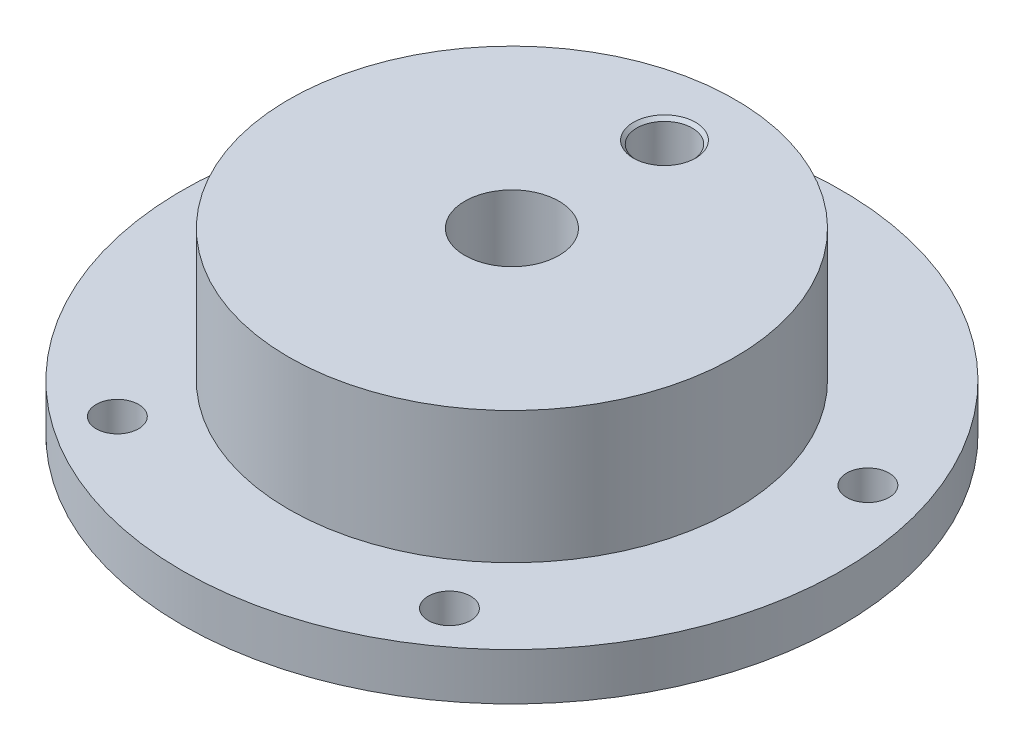
ISO-10303-21;
HEADER;
FILE_DESCRIPTION(('STEP AP214'),'2;1');
FILE_NAME('part.step','',(''),(''),'','','');
FILE_SCHEMA(('AUTOMOTIVE_DESIGN { 1 0 10303 214 1 1 1 1 }'));
ENDSEC;
DATA;
#1=APPLICATION_CONTEXT('core data for automotive mechanical design processes');
#2=APPLICATION_PROTOCOL_DEFINITION('international standard','automotive_design',2000,#1);
#3=PRODUCT_CONTEXT('',#1,'mechanical');
#4=PRODUCT('Part','Part','',(#3));
#5=PRODUCT_RELATED_PRODUCT_CATEGORY('part','',(#4));
#6=PRODUCT_DEFINITION_FORMATION('','',#4);
#7=PRODUCT_DEFINITION_CONTEXT('part definition',#1,'design');
#8=PRODUCT_DEFINITION('design','',#6,#7);
#9=PRODUCT_DEFINITION_SHAPE('','',#8);
#10=(LENGTH_UNIT() NAMED_UNIT(*) SI_UNIT(.MILLI.,.METRE.));
#11=(NAMED_UNIT(*) PLANE_ANGLE_UNIT() SI_UNIT($,.RADIAN.));
#12=(NAMED_UNIT(*) SI_UNIT($,.STERADIAN.) SOLID_ANGLE_UNIT());
#13=UNCERTAINTY_MEASURE_WITH_UNIT(LENGTH_MEASURE(1.E-05),#10,'distance_accuracy_value','');
#14=(GEOMETRIC_REPRESENTATION_CONTEXT(3) GLOBAL_UNCERTAINTY_ASSIGNED_CONTEXT((#13)) GLOBAL_UNIT_ASSIGNED_CONTEXT((#10,
#11,#12)) REPRESENTATION_CONTEXT('',''));
#15=CARTESIAN_POINT('',(0.,0.,0.));
#16=DIRECTION('',(0.,0.,1.));
#17=DIRECTION('',(1.,0.,0.));
#18=AXIS2_PLACEMENT_3D('',#15,#16,#17);
#19=CARTESIAN_POINT('',(-47.4,0.,0.));
#20=DIRECTION('',(0.,1.,0.));
#21=DIRECTION('',(0.,0.,1.));
#22=AXIS2_PLACEMENT_3D('',#19,#20,#21);
#23=PLANE('',#22);
#24=CARTESIAN_POINT('',(0.,0.,-32.4));
#25=DIRECTION('',(0.,1.,0.));
#26=DIRECTION('',(0.,0.,1.));
#27=AXIS2_PLACEMENT_3D('',#24,#25,#26);
#28=CIRCLE('',#27,6.6035);
#29=CARTESIAN_POINT('',(0.,0.,-25.7965));
#30=VERTEX_POINT('',#29);
#31=EDGE_CURVE('E196',#30,#30,#28,.T.);
#32=ORIENTED_EDGE('',*,*,#31,.F.);
#33=EDGE_LOOP('',(#32));
#34=FACE_BOUND('',#33,.T.);
#35=CARTESIAN_POINT('',(0.,0.,0.));
#36=DIRECTION('',(0.,1.,0.));
#37=DIRECTION('',(0.,0.,1.));
#38=AXIS2_PLACEMENT_3D('',#35,#36,#37);
#39=CIRCLE('',#38,47.4);
#40=CARTESIAN_POINT('',(0.,0.,47.4));
#41=VERTEX_POINT('',#40);
#42=EDGE_CURVE('E10',#41,#41,#39,.T.);
#43=ORIENTED_EDGE('',*,*,#42,.T.);
#44=EDGE_LOOP('',(#43));
#45=FACE_BOUND('',#44,.T.);
#46=CARTESIAN_POINT('',(0.,0.,0.));
#47=DIRECTION('',(0.,1.,0.));
#48=DIRECTION('',(0.,0.,1.));
#49=AXIS2_PLACEMENT_3D('',#46,#47,#48);
#50=CIRCLE('',#49,10.);
#51=CARTESIAN_POINT('',(0.,0.,10.));
#52=VERTEX_POINT('',#51);
#53=EDGE_CURVE('E184',#52,#52,#50,.T.);
#54=ORIENTED_EDGE('',*,*,#53,.F.);
#55=EDGE_LOOP('',(#54));
#56=FACE_BOUND('',#55,.T.);
#57=ADVANCED_FACE('F45',(#34,#45,#56),#23,.T.);
#58=CARTESIAN_POINT('',(0.,0.,0.));
#59=DIRECTION('',(0.,1.,0.));
#60=DIRECTION('',(0.,0.,1.));
#61=AXIS2_PLACEMENT_3D('',#58,#59,#60);
#62=CYLINDRICAL_SURFACE('',#61,47.4);
#63=CARTESIAN_POINT('',(0.,-28.,0.));
#64=DIRECTION('',(0.,1.,0.));
#65=DIRECTION('',(0.,0.,1.));
#66=AXIS2_PLACEMENT_3D('',#63,#64,#65);
#67=CIRCLE('',#66,47.4);
#68=CARTESIAN_POINT('',(0.,-28.,47.4));
#69=VERTEX_POINT('',#68);
#70=EDGE_CURVE('E52',#69,#69,#67,.T.);
#71=ORIENTED_EDGE('',*,*,#70,.T.);
#72=EDGE_LOOP('',(#71));
#73=FACE_BOUND('',#72,.T.);
#74=ORIENTED_EDGE('',*,*,#42,.F.);
#75=EDGE_LOOP('',(#74));
#76=FACE_BOUND('',#75,.T.);
#77=ADVANCED_FACE('F255',(#73,#76),#62,.T.);
#78=CARTESIAN_POINT('',(-70.,-28.,0.));
#79=DIRECTION('',(0.,1.,0.));
#80=DIRECTION('',(0.,0.,1.));
#81=AXIS2_PLACEMENT_3D('',#78,#79,#80);
#82=PLANE('',#81);
#83=CARTESIAN_POINT('',(57.0633909777093,-28.,-18.5410196624967));
#84=DIRECTION('',(0.,1.,0.));
#85=DIRECTION('',(-0.951056516295155,0.,0.309016994374945));
#86=AXIS2_PLACEMENT_3D('',#83,#84,#85);
#87=CIRCLE('',#86,4.5);
#88=CARTESIAN_POINT('',(52.7836366543811,-28.,-17.1504431878094));
#89=VERTEX_POINT('',#88);
#90=EDGE_CURVE('E233',#89,#89,#87,.T.);
#91=ORIENTED_EDGE('',*,*,#90,.F.);
#92=EDGE_LOOP('',(#91));
#93=FACE_BOUND('',#92,.T.);
#94=CARTESIAN_POINT('',(35.2671151375481,-28.,48.541019662497));
#95=DIRECTION('',(0.,1.,0.));
#96=DIRECTION('',(-0.587785252292469,0.,-0.809016994374951));
#97=AXIS2_PLACEMENT_3D('',#94,#95,#96);
#98=CIRCLE('',#97,4.5);
#99=CARTESIAN_POINT('',(32.622081502232,-28.,44.9004431878098));
#100=VERTEX_POINT('',#99);
#101=EDGE_CURVE('E225',#100,#100,#98,.T.);
#102=ORIENTED_EDGE('',*,*,#101,.F.);
#103=EDGE_LOOP('',(#102));
#104=FACE_BOUND('',#103,.T.);
#105=CARTESIAN_POINT('',(-35.2671151375488,-28.,48.5410196624965));
#106=DIRECTION('',(0.,1.,0.));
#107=DIRECTION('',(0.58778525229248,0.,-0.809016994374942));
#108=AXIS2_PLACEMENT_3D('',#105,#106,#107);
#109=CIRCLE('',#108,4.5);
#110=CARTESIAN_POINT('',(-32.6220815022327,-28.,44.9004431878093));
#111=VERTEX_POINT('',#110);
#112=EDGE_CURVE('E217',#111,#111,#109,.T.);
#113=ORIENTED_EDGE('',*,*,#112,.F.);
#114=EDGE_LOOP('',(#113));
#115=FACE_BOUND('',#114,.T.);
#116=CARTESIAN_POINT('',(-57.063390977709,-28.,-18.5410196624975));
#117=DIRECTION('',(0.,1.,0.));
#118=DIRECTION('',(0.95105651629515,0.,0.309016994374958));
#119=AXIS2_PLACEMENT_3D('',#116,#117,#118);
#120=CIRCLE('',#119,4.5);
#121=CARTESIAN_POINT('',(-52.7836366543808,-28.,-17.1504431878102));
#122=VERTEX_POINT('',#121);
#123=EDGE_CURVE('E209',#122,#122,#120,.T.);
#124=ORIENTED_EDGE('',*,*,#123,.F.);
#125=EDGE_LOOP('',(#124));
#126=FACE_BOUND('',#125,.T.);
#127=CARTESIAN_POINT('',(0.,-28.,-60.));
#128=DIRECTION('',(0.,1.,0.));
#129=DIRECTION('',(0.,0.,1.));
#130=AXIS2_PLACEMENT_3D('',#127,#128,#129);
#131=CIRCLE('',#130,4.5);
#132=CARTESIAN_POINT('',(0.,-28.,-55.5));
#133=VERTEX_POINT('',#132);
#134=EDGE_CURVE('E201',#133,#133,#131,.T.);
#135=ORIENTED_EDGE('',*,*,#134,.F.);
#136=EDGE_LOOP('',(#135));
#137=FACE_BOUND('',#136,.T.);
#138=CARTESIAN_POINT('',(0.,-28.,0.));
#139=DIRECTION('',(0.,1.,0.));
#140=DIRECTION('',(0.,0.,1.));
#141=AXIS2_PLACEMENT_3D('',#138,#139,#140);
#142=CIRCLE('',#141,70.);
#143=CARTESIAN_POINT('',(0.,-28.,70.));
#144=VERTEX_POINT('',#143);
#145=EDGE_CURVE('E57',#144,#144,#142,.T.);
#146=ORIENTED_EDGE('',*,*,#145,.T.);
#147=EDGE_LOOP('',(#146));
#148=FACE_BOUND('',#147,.T.);
#149=ORIENTED_EDGE('',*,*,#70,.F.);
#150=EDGE_LOOP('',(#149));
#151=FACE_BOUND('',#150,.T.);
#152=ADVANCED_FACE('F251',(#93,#104,#115,#126,#137,#148,#151),#82,.T.);
#153=CARTESIAN_POINT('',(0.,0.,0.));
#154=DIRECTION('',(0.,1.,0.));
#155=DIRECTION('',(0.,0.,1.));
#156=AXIS2_PLACEMENT_3D('',#153,#154,#155);
#157=CYLINDRICAL_SURFACE('',#156,70.);
#158=CARTESIAN_POINT('',(0.,-38.,0.));
#159=DIRECTION('',(0.,1.,0.));
#160=DIRECTION('',(0.,0.,1.));
#161=AXIS2_PLACEMENT_3D('',#158,#159,#160);
#162=CIRCLE('',#161,70.);
#163=CARTESIAN_POINT('',(0.,-38.,70.));
#164=VERTEX_POINT('',#163);
#165=EDGE_CURVE('E62',#164,#164,#162,.T.);
#166=ORIENTED_EDGE('',*,*,#165,.T.);
#167=EDGE_LOOP('',(#166));
#168=FACE_BOUND('',#167,.T.);
#169=ORIENTED_EDGE('',*,*,#145,.F.);
#170=EDGE_LOOP('',(#169));
#171=FACE_BOUND('',#170,.T.);
#172=ADVANCED_FACE('F254',(#168,#171),#157,.T.);
#173=CARTESIAN_POINT('',(-51.,-38.,0.));
#174=DIRECTION('',(0.,-1.,0.));
#175=DIRECTION('',(0.,0.,-1.));
#176=AXIS2_PLACEMENT_3D('',#173,#174,#175);
#177=PLANE('',#176);
#178=CARTESIAN_POINT('',(57.0633909777093,-38.,-18.5410196624967));
#179=DIRECTION('',(0.,1.,0.));
#180=DIRECTION('',(-0.951056516295155,0.,0.309016994374945));
#181=AXIS2_PLACEMENT_3D('',#178,#179,#180);
#182=CIRCLE('',#181,4.5);
#183=CARTESIAN_POINT('',(52.7836366543811,-38.,-17.1504431878094));
#184=VERTEX_POINT('',#183);
#185=EDGE_CURVE('E205',#184,#184,#182,.T.);
#186=ORIENTED_EDGE('',*,*,#185,.T.);
#187=EDGE_LOOP('',(#186));
#188=FACE_BOUND('',#187,.T.);
#189=CARTESIAN_POINT('',(35.2671151375481,-38.,48.541019662497));
#190=DIRECTION('',(0.,1.,0.));
#191=DIRECTION('',(-0.587785252292469,0.,-0.809016994374951));
#192=AXIS2_PLACEMENT_3D('',#189,#190,#191);
#193=CIRCLE('',#192,4.5);
#194=CARTESIAN_POINT('',(32.622081502232,-38.,44.9004431878098));
#195=VERTEX_POINT('',#194);
#196=EDGE_CURVE('E229',#195,#195,#193,.T.);
#197=ORIENTED_EDGE('',*,*,#196,.T.);
#198=EDGE_LOOP('',(#197));
#199=FACE_BOUND('',#198,.T.);
#200=CARTESIAN_POINT('',(-35.2671151375488,-38.,48.5410196624965));
#201=DIRECTION('',(0.,1.,0.));
#202=DIRECTION('',(0.58778525229248,0.,-0.809016994374942));
#203=AXIS2_PLACEMENT_3D('',#200,#201,#202);
#204=CIRCLE('',#203,4.5);
#205=CARTESIAN_POINT('',(-32.6220815022327,-38.,44.9004431878093));
#206=VERTEX_POINT('',#205);
#207=EDGE_CURVE('E221',#206,#206,#204,.T.);
#208=ORIENTED_EDGE('',*,*,#207,.T.);
#209=EDGE_LOOP('',(#208));
#210=FACE_BOUND('',#209,.T.);
#211=CARTESIAN_POINT('',(-57.063390977709,-38.,-18.5410196624975));
#212=DIRECTION('',(0.,1.,0.));
#213=DIRECTION('',(0.95105651629515,0.,0.309016994374958));
#214=AXIS2_PLACEMENT_3D('',#211,#212,#213);
#215=CIRCLE('',#214,4.5);
#216=CARTESIAN_POINT('',(-52.7836366543808,-38.,-17.1504431878102));
#217=VERTEX_POINT('',#216);
#218=EDGE_CURVE('E213',#217,#217,#215,.T.);
#219=ORIENTED_EDGE('',*,*,#218,.T.);
#220=EDGE_LOOP('',(#219));
#221=FACE_BOUND('',#220,.T.);
#222=CARTESIAN_POINT('',(0.,-38.,-60.));
#223=DIRECTION('',(0.,1.,0.));
#224=DIRECTION('',(0.,0.,1.));
#225=AXIS2_PLACEMENT_3D('',#222,#223,#224);
#226=CIRCLE('',#225,4.5);
#227=CARTESIAN_POINT('',(0.,-38.,-55.5));
#228=VERTEX_POINT('',#227);
#229=EDGE_CURVE('E200',#228,#228,#226,.T.);
#230=ORIENTED_EDGE('',*,*,#229,.T.);
#231=EDGE_LOOP('',(#230));
#232=FACE_BOUND('',#231,.T.);
#233=CARTESIAN_POINT('',(0.,-38.,0.));
#234=DIRECTION('',(0.,1.,0.));
#235=DIRECTION('',(0.,0.,1.));
#236=AXIS2_PLACEMENT_3D('',#233,#234,#235);
#237=CIRCLE('',#236,51.);
#238=CARTESIAN_POINT('',(0.,-38.,51.));
#239=VERTEX_POINT('',#238);
#240=EDGE_CURVE('E68',#239,#239,#237,.T.);
#241=ORIENTED_EDGE('',*,*,#240,.T.);
#242=EDGE_LOOP('',(#241));
#243=FACE_BOUND('',#242,.T.);
#244=ORIENTED_EDGE('',*,*,#165,.F.);
#245=EDGE_LOOP('',(#244));
#246=FACE_BOUND('',#245,.T.);
#247=ADVANCED_FACE('F241',(#188,#199,#210,#221,#232,#243,#246),#177,.T.);
#248=CARTESIAN_POINT('',(0.,0.,0.));
#249=DIRECTION('',(0.,1.,0.));
#250=DIRECTION('',(0.,0.,1.));
#251=AXIS2_PLACEMENT_3D('',#248,#249,#250);
#252=CYLINDRICAL_SURFACE('',#251,51.);
#253=CARTESIAN_POINT('',(0.,-36.2080332580664,0.));
#254=DIRECTION('',(0.,1.,0.));
#255=DIRECTION('',(0.,0.,1.));
#256=AXIS2_PLACEMENT_3D('',#253,#254,#255);
#257=CIRCLE('',#256,51.);
#258=CARTESIAN_POINT('',(0.,-36.2080332580664,51.));
#259=VERTEX_POINT('',#258);
#260=EDGE_CURVE('E72',#259,#259,#257,.T.);
#261=ORIENTED_EDGE('',*,*,#260,.T.);
#262=EDGE_LOOP('',(#261));
#263=FACE_BOUND('',#262,.T.);
#264=ORIENTED_EDGE('',*,*,#240,.F.);
#265=EDGE_LOOP('',(#264));
#266=FACE_BOUND('',#265,.T.);
#267=ADVANCED_FACE('F274',(#263,#266),#252,.F.);
#268=CARTESIAN_POINT('',(0.,-36.2080332580664,0.));
#269=DIRECTION('',(0.,1.,0.));
#270=DIRECTION('',(0.,0.,1.));
#271=AXIS2_PLACEMENT_3D('',#268,#269,#270);
#272=TOROIDAL_SURFACE('',#271,50.7919667419336,0.208033258066388);
#273=CARTESIAN_POINT('',(0.,-36.,0.));
#274=DIRECTION('',(0.,1.,0.));
#275=DIRECTION('',(0.,0.,1.));
#276=AXIS2_PLACEMENT_3D('',#273,#274,#275);
#277=CIRCLE('',#276,50.7919667419336);
#278=CARTESIAN_POINT('',(0.,-36.,50.7919667419336));
#279=VERTEX_POINT('',#278);
#280=EDGE_CURVE('E76',#279,#279,#277,.T.);
#281=ORIENTED_EDGE('',*,*,#280,.T.);
#282=EDGE_LOOP('',(#281));
#283=FACE_BOUND('',#282,.T.);
#284=ORIENTED_EDGE('',*,*,#260,.F.);
#285=EDGE_LOOP('',(#284));
#286=FACE_BOUND('',#285,.T.);
#287=ADVANCED_FACE('F446',(#283,#286),#272,.F.);
#288=CARTESIAN_POINT('',(-47.9580332580664,-36.,0.));
#289=DIRECTION('',(0.,-1.,0.));
#290=DIRECTION('',(0.,0.,-1.));
#291=AXIS2_PLACEMENT_3D('',#288,#289,#290);
#292=PLANE('',#291);
#293=CARTESIAN_POINT('',(0.,-36.,0.));
#294=DIRECTION('',(0.,1.,0.));
#295=DIRECTION('',(0.,0.,1.));
#296=AXIS2_PLACEMENT_3D('',#293,#294,#295);
#297=CIRCLE('',#296,47.9580332580664);
#298=CARTESIAN_POINT('',(0.,-36.,47.9580332580664));
#299=VERTEX_POINT('',#298);
#300=EDGE_CURVE('E80',#299,#299,#297,.T.);
#301=ORIENTED_EDGE('',*,*,#300,.T.);
#302=EDGE_LOOP('',(#301));
#303=FACE_BOUND('',#302,.T.);
#304=ORIENTED_EDGE('',*,*,#280,.F.);
#305=EDGE_LOOP('',(#304));
#306=FACE_BOUND('',#305,.T.);
#307=ADVANCED_FACE('F440',(#303,#306),#292,.T.);
#308=CARTESIAN_POINT('',(0.,-36.2080332580664,0.));
#309=DIRECTION('',(0.,1.,0.));
#310=DIRECTION('',(0.,0.,1.));
#311=AXIS2_PLACEMENT_3D('',#308,#309,#310);
#312=TOROIDAL_SURFACE('',#311,47.9580332580664,0.208033258066391);
#313=CARTESIAN_POINT('',(0.,-36.2080332580664,0.));
#314=DIRECTION('',(0.,1.,0.));
#315=DIRECTION('',(0.,0.,1.));
#316=AXIS2_PLACEMENT_3D('',#313,#314,#315);
#317=CIRCLE('',#316,47.75);
#318=CARTESIAN_POINT('',(0.,-36.2080332580664,47.75));
#319=VERTEX_POINT('',#318);
#320=EDGE_CURVE('E84',#319,#319,#317,.T.);
#321=ORIENTED_EDGE('',*,*,#320,.T.);
#322=EDGE_LOOP('',(#321));
#323=FACE_BOUND('',#322,.T.);
#324=ORIENTED_EDGE('',*,*,#300,.F.);
#325=EDGE_LOOP('',(#324));
#326=FACE_BOUND('',#325,.T.);
#327=ADVANCED_FACE('F434',(#323,#326),#312,.F.);
#328=CARTESIAN_POINT('',(0.,0.,0.));
#329=DIRECTION('',(0.,1.,0.));
#330=DIRECTION('',(0.,0.,1.));
#331=AXIS2_PLACEMENT_3D('',#328,#329,#330);
#332=CYLINDRICAL_SURFACE('',#331,47.75);
#333=CARTESIAN_POINT('',(0.,-38.,0.));
#334=DIRECTION('',(0.,1.,0.));
#335=DIRECTION('',(0.,0.,1.));
#336=AXIS2_PLACEMENT_3D('',#333,#334,#335);
#337=CIRCLE('',#336,47.75);
#338=CARTESIAN_POINT('',(0.,-38.,47.75));
#339=VERTEX_POINT('',#338);
#340=EDGE_CURVE('E88',#339,#339,#337,.T.);
#341=ORIENTED_EDGE('',*,*,#340,.T.);
#342=EDGE_LOOP('',(#341));
#343=FACE_BOUND('',#342,.T.);
#344=ORIENTED_EDGE('',*,*,#320,.F.);
#345=EDGE_LOOP('',(#344));
#346=FACE_BOUND('',#345,.T.);
#347=ADVANCED_FACE('F428',(#343,#346),#332,.T.);
#348=CARTESIAN_POINT('',(-45.25,-38.,0.));
#349=DIRECTION('',(0.,-1.,0.));
#350=DIRECTION('',(0.,0.,-1.));
#351=AXIS2_PLACEMENT_3D('',#348,#349,#350);
#352=PLANE('',#351);
#353=CARTESIAN_POINT('',(0.,-38.,0.));
#354=DIRECTION('',(0.,1.,0.));
#355=DIRECTION('',(0.,0.,1.));
#356=AXIS2_PLACEMENT_3D('',#353,#354,#355);
#357=CIRCLE('',#356,45.25);
#358=CARTESIAN_POINT('',(0.,-38.,45.25));
#359=VERTEX_POINT('',#358);
#360=EDGE_CURVE('E92',#359,#359,#357,.T.);
#361=ORIENTED_EDGE('',*,*,#360,.T.);
#362=EDGE_LOOP('',(#361));
#363=FACE_BOUND('',#362,.T.);
#364=ORIENTED_EDGE('',*,*,#340,.F.);
#365=EDGE_LOOP('',(#364));
#366=FACE_BOUND('',#365,.T.);
#367=ADVANCED_FACE('F422',(#363,#366),#352,.T.);
#368=CARTESIAN_POINT('',(0.,0.,0.));
#369=DIRECTION('',(0.,1.,0.));
#370=DIRECTION('',(0.,0.,1.));
#371=AXIS2_PLACEMENT_3D('',#368,#369,#370);
#372=CYLINDRICAL_SURFACE('',#371,45.25);
#373=CARTESIAN_POINT('',(0.,-36.2080332580664,0.));
#374=DIRECTION('',(0.,1.,0.));
#375=DIRECTION('',(0.,0.,1.));
#376=AXIS2_PLACEMENT_3D('',#373,#374,#375);
#377=CIRCLE('',#376,45.25);
#378=CARTESIAN_POINT('',(0.,-36.2080332580664,45.25));
#379=VERTEX_POINT('',#378);
#380=EDGE_CURVE('E96',#379,#379,#377,.T.);
#381=ORIENTED_EDGE('',*,*,#380,.T.);
#382=EDGE_LOOP('',(#381));
#383=FACE_BOUND('',#382,.T.);
#384=ORIENTED_EDGE('',*,*,#360,.F.);
#385=EDGE_LOOP('',(#384));
#386=FACE_BOUND('',#385,.T.);
#387=ADVANCED_FACE('F416',(#383,#386),#372,.F.);
#388=CARTESIAN_POINT('',(0.,-36.2080332580664,0.));
#389=DIRECTION('',(0.,1.,0.));
#390=DIRECTION('',(0.,0.,1.));
#391=AXIS2_PLACEMENT_3D('',#388,#389,#390);
#392=TOROIDAL_SURFACE('',#391,45.0419667419336,0.208033258066391);
#393=CARTESIAN_POINT('',(0.,-36.,0.));
#394=DIRECTION('',(0.,1.,0.));
#395=DIRECTION('',(0.,0.,1.));
#396=AXIS2_PLACEMENT_3D('',#393,#394,#395);
#397=CIRCLE('',#396,45.0419667419336);
#398=CARTESIAN_POINT('',(0.,-36.,45.0419667419336));
#399=VERTEX_POINT('',#398);
#400=EDGE_CURVE('E100',#399,#399,#397,.T.);
#401=ORIENTED_EDGE('',*,*,#400,.T.);
#402=EDGE_LOOP('',(#401));
#403=FACE_BOUND('',#402,.T.);
#404=ORIENTED_EDGE('',*,*,#380,.F.);
#405=EDGE_LOOP('',(#404));
#406=FACE_BOUND('',#405,.T.);
#407=ADVANCED_FACE('F410',(#403,#406),#392,.F.);
#408=CARTESIAN_POINT('',(-42.2080332580664,-36.,0.));
#409=DIRECTION('',(0.,-1.,0.));
#410=DIRECTION('',(0.,0.,-1.));
#411=AXIS2_PLACEMENT_3D('',#408,#409,#410);
#412=PLANE('',#411);
#413=CARTESIAN_POINT('',(0.,-36.,0.));
#414=DIRECTION('',(0.,1.,0.));
#415=DIRECTION('',(0.,0.,1.));
#416=AXIS2_PLACEMENT_3D('',#413,#414,#415);
#417=CIRCLE('',#416,42.2080332580664);
#418=CARTESIAN_POINT('',(0.,-36.,42.2080332580664));
#419=VERTEX_POINT('',#418);
#420=EDGE_CURVE('E104',#419,#419,#417,.T.);
#421=ORIENTED_EDGE('',*,*,#420,.T.);
#422=EDGE_LOOP('',(#421));
#423=FACE_BOUND('',#422,.T.);
#424=ORIENTED_EDGE('',*,*,#400,.F.);
#425=EDGE_LOOP('',(#424));
#426=FACE_BOUND('',#425,.T.);
#427=ADVANCED_FACE('F404',(#423,#426),#412,.T.);
#428=CARTESIAN_POINT('',(0.,-36.2080332580664,0.));
#429=DIRECTION('',(0.,1.,0.));
#430=DIRECTION('',(0.,0.,1.));
#431=AXIS2_PLACEMENT_3D('',#428,#429,#430);
#432=TOROIDAL_SURFACE('',#431,42.2080332580664,0.208033258066388);
#433=CARTESIAN_POINT('',(0.,-36.2080332580664,0.));
#434=DIRECTION('',(0.,1.,0.));
#435=DIRECTION('',(0.,0.,1.));
#436=AXIS2_PLACEMENT_3D('',#433,#434,#435);
#437=CIRCLE('',#436,42.);
#438=CARTESIAN_POINT('',(0.,-36.2080332580664,42.));
#439=VERTEX_POINT('',#438);
#440=EDGE_CURVE('E108',#439,#439,#437,.T.);
#441=ORIENTED_EDGE('',*,*,#440,.T.);
#442=EDGE_LOOP('',(#441));
#443=FACE_BOUND('',#442,.T.);
#444=ORIENTED_EDGE('',*,*,#420,.F.);
#445=EDGE_LOOP('',(#444));
#446=FACE_BOUND('',#445,.T.);
#447=ADVANCED_FACE('F398',(#443,#446),#432,.F.);
#448=CARTESIAN_POINT('',(0.,0.,0.));
#449=DIRECTION('',(0.,1.,0.));
#450=DIRECTION('',(0.,0.,1.));
#451=AXIS2_PLACEMENT_3D('',#448,#449,#450);
#452=CYLINDRICAL_SURFACE('',#451,42.);
#453=CARTESIAN_POINT('',(0.,-38.,0.));
#454=DIRECTION('',(0.,1.,0.));
#455=DIRECTION('',(0.,0.,1.));
#456=AXIS2_PLACEMENT_3D('',#453,#454,#455);
#457=CIRCLE('',#456,42.);
#458=CARTESIAN_POINT('',(0.,-38.,42.));
#459=VERTEX_POINT('',#458);
#460=EDGE_CURVE('E112',#459,#459,#457,.T.);
#461=ORIENTED_EDGE('',*,*,#460,.T.);
#462=EDGE_LOOP('',(#461));
#463=FACE_BOUND('',#462,.T.);
#464=ORIENTED_EDGE('',*,*,#440,.F.);
#465=EDGE_LOOP('',(#464));
#466=FACE_BOUND('',#465,.T.);
#467=ADVANCED_FACE('F392',(#463,#466),#452,.T.);
#468=CARTESIAN_POINT('',(-39.4,-38.,0.));
#469=DIRECTION('',(0.,-1.,0.));
#470=DIRECTION('',(0.,0.,-1.));
#471=AXIS2_PLACEMENT_3D('',#468,#469,#470);
#472=PLANE('',#471);
#473=CARTESIAN_POINT('',(0.,-38.,0.));
#474=DIRECTION('',(0.,1.,0.));
#475=DIRECTION('',(0.,0.,1.));
#476=AXIS2_PLACEMENT_3D('',#473,#474,#475);
#477=CIRCLE('',#476,39.4);
#478=CARTESIAN_POINT('',(0.,-38.,39.4));
#479=VERTEX_POINT('',#478);
#480=EDGE_CURVE('E116',#479,#479,#477,.T.);
#481=ORIENTED_EDGE('',*,*,#480,.T.);
#482=EDGE_LOOP('',(#481));
#483=FACE_BOUND('',#482,.T.);
#484=ORIENTED_EDGE('',*,*,#460,.F.);
#485=EDGE_LOOP('',(#484));
#486=FACE_BOUND('',#485,.T.);
#487=ADVANCED_FACE('F386',(#483,#486),#472,.T.);
#488=CARTESIAN_POINT('',(0.,0.,0.));
#489=DIRECTION('',(0.,1.,0.));
#490=DIRECTION('',(0.,0.,1.));
#491=AXIS2_PLACEMENT_3D('',#488,#489,#490);
#492=CYLINDRICAL_SURFACE('',#491,39.4);
#493=CARTESIAN_POINT('',(0.,-10.,0.));
#494=DIRECTION('',(0.,1.,0.));
#495=DIRECTION('',(0.,0.,1.));
#496=AXIS2_PLACEMENT_3D('',#493,#494,#495);
#497=CIRCLE('',#496,39.4);
#498=CARTESIAN_POINT('',(0.,-10.,39.4));
#499=VERTEX_POINT('',#498);
#500=EDGE_CURVE('E120',#499,#499,#497,.T.);
#501=ORIENTED_EDGE('',*,*,#500,.T.);
#502=EDGE_LOOP('',(#501));
#503=FACE_BOUND('',#502,.T.);
#504=ORIENTED_EDGE('',*,*,#480,.F.);
#505=EDGE_LOOP('',(#504));
#506=FACE_BOUND('',#505,.T.);
#507=ADVANCED_FACE('F379',(#503,#506),#492,.F.);
#508=CARTESIAN_POINT('',(-39.4,-10.,0.));
#509=DIRECTION('',(0.,-1.,0.));
#510=DIRECTION('',(0.,0.,-1.));
#511=AXIS2_PLACEMENT_3D('',#508,#509,#510);
#512=PLANE('',#511);
#513=CARTESIAN_POINT('',(0.,-10.,-32.4));
#514=DIRECTION('',(0.,-1.,0.));
#515=DIRECTION('',(0.,0.,-1.));
#516=AXIS2_PLACEMENT_3D('',#513,#514,#515);
#517=CIRCLE('',#516,5.9);
#518=CARTESIAN_POINT('',(0.,-10.,-38.3));
#519=VERTEX_POINT('',#518);
#520=EDGE_CURVE('E188',#519,#519,#517,.T.);
#521=ORIENTED_EDGE('',*,*,#520,.F.);
#522=EDGE_LOOP('',(#521));
#523=FACE_BOUND('',#522,.T.);
#524=CARTESIAN_POINT('',(0.,-10.,0.));
#525=DIRECTION('',(0.,1.,0.));
#526=DIRECTION('',(0.,0.,1.));
#527=AXIS2_PLACEMENT_3D('',#524,#525,#526);
#528=CIRCLE('',#527,24.);
#529=CARTESIAN_POINT('',(0.,-10.,24.));
#530=VERTEX_POINT('',#529);
#531=EDGE_CURVE('E124',#530,#530,#528,.T.);
#532=ORIENTED_EDGE('',*,*,#531,.T.);
#533=EDGE_LOOP('',(#532));
#534=FACE_BOUND('',#533,.T.);
#535=ORIENTED_EDGE('',*,*,#500,.F.);
#536=EDGE_LOOP('',(#535));
#537=FACE_BOUND('',#536,.T.);
#538=ADVANCED_FACE('F373',(#523,#534,#537),#512,.T.);
#539=CARTESIAN_POINT('',(0.,0.,0.));
#540=DIRECTION('',(0.,1.,0.));
#541=DIRECTION('',(0.,0.,1.));
#542=AXIS2_PLACEMENT_3D('',#539,#540,#541);
#543=CYLINDRICAL_SURFACE('',#542,24.);
#544=CARTESIAN_POINT('',(0.,-38.,0.));
#545=DIRECTION('',(0.,1.,0.));
#546=DIRECTION('',(0.,0.,1.));
#547=AXIS2_PLACEMENT_3D('',#544,#545,#546);
#548=CIRCLE('',#547,24.);
#549=CARTESIAN_POINT('',(0.,-38.,24.));
#550=VERTEX_POINT('',#549);
#551=EDGE_CURVE('E128',#550,#550,#548,.T.);
#552=ORIENTED_EDGE('',*,*,#551,.T.);
#553=EDGE_LOOP('',(#552));
#554=FACE_BOUND('',#553,.T.);
#555=ORIENTED_EDGE('',*,*,#531,.F.);
#556=EDGE_LOOP('',(#555));
#557=FACE_BOUND('',#556,.T.);
#558=ADVANCED_FACE('F367',(#554,#557),#543,.T.);
#559=CARTESIAN_POINT('',(-21.75,-38.,0.));
#560=DIRECTION('',(0.,-1.,0.));
#561=DIRECTION('',(0.,0.,-1.));
#562=AXIS2_PLACEMENT_3D('',#559,#560,#561);
#563=PLANE('',#562);
#564=CARTESIAN_POINT('',(0.,-38.,0.));
#565=DIRECTION('',(0.,1.,0.));
#566=DIRECTION('',(0.,0.,1.));
#567=AXIS2_PLACEMENT_3D('',#564,#565,#566);
#568=CIRCLE('',#567,21.75);
#569=CARTESIAN_POINT('',(0.,-38.,21.75));
#570=VERTEX_POINT('',#569);
#571=EDGE_CURVE('E132',#570,#570,#568,.T.);
#572=ORIENTED_EDGE('',*,*,#571,.T.);
#573=EDGE_LOOP('',(#572));
#574=FACE_BOUND('',#573,.T.);
#575=ORIENTED_EDGE('',*,*,#551,.F.);
#576=EDGE_LOOP('',(#575));
#577=FACE_BOUND('',#576,.T.);
#578=ADVANCED_FACE('F361',(#574,#577),#563,.T.);
#579=CARTESIAN_POINT('',(0.,0.,0.));
#580=DIRECTION('',(0.,1.,0.));
#581=DIRECTION('',(0.,0.,1.));
#582=AXIS2_PLACEMENT_3D('',#579,#580,#581);
#583=CYLINDRICAL_SURFACE('',#582,21.75);
#584=CARTESIAN_POINT('',(0.,-36.2080332580664,0.));
#585=DIRECTION('',(0.,1.,0.));
#586=DIRECTION('',(0.,0.,1.));
#587=AXIS2_PLACEMENT_3D('',#584,#585,#586);
#588=CIRCLE('',#587,21.75);
#589=CARTESIAN_POINT('',(0.,-36.2080332580664,21.75));
#590=VERTEX_POINT('',#589);
#591=EDGE_CURVE('E136',#590,#590,#588,.T.);
#592=ORIENTED_EDGE('',*,*,#591,.T.);
#593=EDGE_LOOP('',(#592));
#594=FACE_BOUND('',#593,.T.);
#595=ORIENTED_EDGE('',*,*,#571,.F.);
#596=EDGE_LOOP('',(#595));
#597=FACE_BOUND('',#596,.T.);
#598=ADVANCED_FACE('F355',(#594,#597),#583,.F.);
#599=CARTESIAN_POINT('',(0.,-36.2080332580664,0.));
#600=DIRECTION('',(0.,1.,0.));
#601=DIRECTION('',(0.,0.,1.));
#602=AXIS2_PLACEMENT_3D('',#599,#600,#601);
#603=TOROIDAL_SURFACE('',#602,21.5419667419336,0.208033258066393);
#604=CARTESIAN_POINT('',(0.,-36.,0.));
#605=DIRECTION('',(0.,1.,0.));
#606=DIRECTION('',(0.,0.,1.));
#607=AXIS2_PLACEMENT_3D('',#604,#605,#606);
#608=CIRCLE('',#607,21.5419667419336);
#609=CARTESIAN_POINT('',(0.,-36.,21.5419667419336));
#610=VERTEX_POINT('',#609);
#611=EDGE_CURVE('E140',#610,#610,#608,.T.);
#612=ORIENTED_EDGE('',*,*,#611,.T.);
#613=EDGE_LOOP('',(#612));
#614=FACE_BOUND('',#613,.T.);
#615=ORIENTED_EDGE('',*,*,#591,.F.);
#616=EDGE_LOOP('',(#615));
#617=FACE_BOUND('',#616,.T.);
#618=ADVANCED_FACE('F349',(#614,#617),#603,.F.);
#619=CARTESIAN_POINT('',(-18.7080332580664,-36.,0.));
#620=DIRECTION('',(0.,-1.,0.));
#621=DIRECTION('',(0.,0.,-1.));
#622=AXIS2_PLACEMENT_3D('',#619,#620,#621);
#623=PLANE('',#622);
#624=CARTESIAN_POINT('',(0.,-36.,0.));
#625=DIRECTION('',(0.,1.,0.));
#626=DIRECTION('',(0.,0.,1.));
#627=AXIS2_PLACEMENT_3D('',#624,#625,#626);
#628=CIRCLE('',#627,18.7080332580664);
#629=CARTESIAN_POINT('',(0.,-36.,18.7080332580664));
#630=VERTEX_POINT('',#629);
#631=EDGE_CURVE('E144',#630,#630,#628,.T.);
#632=ORIENTED_EDGE('',*,*,#631,.T.);
#633=EDGE_LOOP('',(#632));
#634=FACE_BOUND('',#633,.T.);
#635=ORIENTED_EDGE('',*,*,#611,.F.);
#636=EDGE_LOOP('',(#635));
#637=FACE_BOUND('',#636,.T.);
#638=ADVANCED_FACE('F343',(#634,#637),#623,.T.);
#639=CARTESIAN_POINT('',(0.,-36.2080332580664,0.));
#640=DIRECTION('',(0.,1.,0.));
#641=DIRECTION('',(0.,0.,1.));
#642=AXIS2_PLACEMENT_3D('',#639,#640,#641);
#643=TOROIDAL_SURFACE('',#642,18.7080332580664,0.208033258066394);
#644=CARTESIAN_POINT('',(0.,-36.2080332580664,0.));
#645=DIRECTION('',(0.,1.,0.));
#646=DIRECTION('',(0.,0.,1.));
#647=AXIS2_PLACEMENT_3D('',#644,#645,#646);
#648=CIRCLE('',#647,18.5);
#649=CARTESIAN_POINT('',(0.,-36.2080332580664,18.5));
#650=VERTEX_POINT('',#649);
#651=EDGE_CURVE('E148',#650,#650,#648,.T.);
#652=ORIENTED_EDGE('',*,*,#651,.T.);
#653=EDGE_LOOP('',(#652));
#654=FACE_BOUND('',#653,.T.);
#655=ORIENTED_EDGE('',*,*,#631,.F.);
#656=EDGE_LOOP('',(#655));
#657=FACE_BOUND('',#656,.T.);
#658=ADVANCED_FACE('F337',(#654,#657),#643,.F.);
#659=CARTESIAN_POINT('',(0.,0.,0.));
#660=DIRECTION('',(0.,1.,0.));
#661=DIRECTION('',(0.,0.,1.));
#662=AXIS2_PLACEMENT_3D('',#659,#660,#661);
#663=CYLINDRICAL_SURFACE('',#662,18.5);
#664=CARTESIAN_POINT('',(0.,-38.,0.));
#665=DIRECTION('',(0.,1.,0.));
#666=DIRECTION('',(0.,0.,1.));
#667=AXIS2_PLACEMENT_3D('',#664,#665,#666);
#668=CIRCLE('',#667,18.5);
#669=CARTESIAN_POINT('',(0.,-38.,18.5));
#670=VERTEX_POINT('',#669);
#671=EDGE_CURVE('E152',#670,#670,#668,.T.);
#672=ORIENTED_EDGE('',*,*,#671,.T.);
#673=EDGE_LOOP('',(#672));
#674=FACE_BOUND('',#673,.T.);
#675=ORIENTED_EDGE('',*,*,#651,.F.);
#676=EDGE_LOOP('',(#675));
#677=FACE_BOUND('',#676,.T.);
#678=ADVANCED_FACE('F331',(#674,#677),#663,.T.);
#679=CARTESIAN_POINT('',(-15.75,-38.,0.));
#680=DIRECTION('',(0.,-1.,0.));
#681=DIRECTION('',(0.,0.,-1.));
#682=AXIS2_PLACEMENT_3D('',#679,#680,#681);
#683=PLANE('',#682);
#684=CARTESIAN_POINT('',(0.,-38.,0.));
#685=DIRECTION('',(0.,1.,0.));
#686=DIRECTION('',(0.,0.,1.));
#687=AXIS2_PLACEMENT_3D('',#684,#685,#686);
#688=CIRCLE('',#687,15.75);
#689=CARTESIAN_POINT('',(0.,-38.,15.75));
#690=VERTEX_POINT('',#689);
#691=EDGE_CURVE('E156',#690,#690,#688,.T.);
#692=ORIENTED_EDGE('',*,*,#691,.T.);
#693=EDGE_LOOP('',(#692));
#694=FACE_BOUND('',#693,.T.);
#695=ORIENTED_EDGE('',*,*,#671,.F.);
#696=EDGE_LOOP('',(#695));
#697=FACE_BOUND('',#696,.T.);
#698=ADVANCED_FACE('F325',(#694,#697),#683,.T.);
#699=CARTESIAN_POINT('',(0.,0.,0.));
#700=DIRECTION('',(0.,1.,0.));
#701=DIRECTION('',(0.,0.,1.));
#702=AXIS2_PLACEMENT_3D('',#699,#700,#701);
#703=CYLINDRICAL_SURFACE('',#702,15.75);
#704=CARTESIAN_POINT('',(0.,-36.2080332580664,0.));
#705=DIRECTION('',(0.,1.,0.));
#706=DIRECTION('',(0.,0.,1.));
#707=AXIS2_PLACEMENT_3D('',#704,#705,#706);
#708=CIRCLE('',#707,15.75);
#709=CARTESIAN_POINT('',(0.,-36.2080332580664,15.75));
#710=VERTEX_POINT('',#709);
#711=EDGE_CURVE('E160',#710,#710,#708,.T.);
#712=ORIENTED_EDGE('',*,*,#711,.T.);
#713=EDGE_LOOP('',(#712));
#714=FACE_BOUND('',#713,.T.);
#715=ORIENTED_EDGE('',*,*,#691,.F.);
#716=EDGE_LOOP('',(#715));
#717=FACE_BOUND('',#716,.T.);
#718=ADVANCED_FACE('F319',(#714,#717),#703,.F.);
#719=CARTESIAN_POINT('',(0.,-36.2080332580664,0.));
#720=DIRECTION('',(0.,1.,0.));
#721=DIRECTION('',(0.,0.,1.));
#722=AXIS2_PLACEMENT_3D('',#719,#720,#721);
#723=TOROIDAL_SURFACE('',#722,15.5419667419336,0.208033258066389);
#724=CARTESIAN_POINT('',(0.,-36.,0.));
#725=DIRECTION('',(0.,1.,0.));
#726=DIRECTION('',(0.,0.,1.));
#727=AXIS2_PLACEMENT_3D('',#724,#725,#726);
#728=CIRCLE('',#727,15.5419667419336);
#729=CARTESIAN_POINT('',(0.,-36.,15.5419667419336));
#730=VERTEX_POINT('',#729);
#731=EDGE_CURVE('E164',#730,#730,#728,.T.);
#732=ORIENTED_EDGE('',*,*,#731,.T.);
#733=EDGE_LOOP('',(#732));
#734=FACE_BOUND('',#733,.T.);
#735=ORIENTED_EDGE('',*,*,#711,.F.);
#736=EDGE_LOOP('',(#735));
#737=FACE_BOUND('',#736,.T.);
#738=ADVANCED_FACE('F313',(#734,#737),#723,.F.);
#739=CARTESIAN_POINT('',(-12.7,-36.,0.));
#740=DIRECTION('',(0.,-1.,0.));
#741=DIRECTION('',(0.,0.,-1.));
#742=AXIS2_PLACEMENT_3D('',#739,#740,#741);
#743=PLANE('',#742);
#744=CARTESIAN_POINT('',(0.,-36.,0.));
#745=DIRECTION('',(0.,1.,0.));
#746=DIRECTION('',(0.,0.,1.));
#747=AXIS2_PLACEMENT_3D('',#744,#745,#746);
#748=CIRCLE('',#747,12.7);
#749=CARTESIAN_POINT('',(0.,-36.,12.7));
#750=VERTEX_POINT('',#749);
#751=EDGE_CURVE('E168',#750,#750,#748,.T.);
#752=ORIENTED_EDGE('',*,*,#751,.T.);
#753=EDGE_LOOP('',(#752));
#754=FACE_BOUND('',#753,.T.);
#755=ORIENTED_EDGE('',*,*,#731,.F.);
#756=EDGE_LOOP('',(#755));
#757=FACE_BOUND('',#756,.T.);
#758=ADVANCED_FACE('F307',(#754,#757),#743,.T.);
#759=CARTESIAN_POINT('',(0.,-36.2,0.));
#760=DIRECTION('',(0.,1.,0.));
#761=DIRECTION('',(0.,0.,1.));
#762=AXIS2_PLACEMENT_3D('',#759,#760,#761);
#763=TOROIDAL_SURFACE('',#762,12.7,0.200000000000001);
#764=CARTESIAN_POINT('',(0.,-36.2,0.));
#765=DIRECTION('',(0.,1.,0.));
#766=DIRECTION('',(0.,0.,1.));
#767=AXIS2_PLACEMENT_3D('',#764,#765,#766);
#768=CIRCLE('',#767,12.5);
#769=CARTESIAN_POINT('',(0.,-36.2,12.5));
#770=VERTEX_POINT('',#769);
#771=EDGE_CURVE('E172',#770,#770,#768,.T.);
#772=ORIENTED_EDGE('',*,*,#771,.T.);
#773=EDGE_LOOP('',(#772));
#774=FACE_BOUND('',#773,.T.);
#775=ORIENTED_EDGE('',*,*,#751,.F.);
#776=EDGE_LOOP('',(#775));
#777=FACE_BOUND('',#776,.T.);
#778=ADVANCED_FACE('F301',(#774,#777),#763,.F.);
#779=CARTESIAN_POINT('',(0.,0.,0.));
#780=DIRECTION('',(0.,1.,0.));
#781=DIRECTION('',(0.,0.,1.));
#782=AXIS2_PLACEMENT_3D('',#779,#780,#781);
#783=CYLINDRICAL_SURFACE('',#782,12.5);
#784=CARTESIAN_POINT('',(0.,-38.,0.));
#785=DIRECTION('',(0.,1.,0.));
#786=DIRECTION('',(0.,0.,1.));
#787=AXIS2_PLACEMENT_3D('',#784,#785,#786);
#788=CIRCLE('',#787,12.5);
#789=CARTESIAN_POINT('',(0.,-38.,12.5));
#790=VERTEX_POINT('',#789);
#791=EDGE_CURVE('E176',#790,#790,#788,.T.);
#792=ORIENTED_EDGE('',*,*,#791,.T.);
#793=EDGE_LOOP('',(#792));
#794=FACE_BOUND('',#793,.T.);
#795=ORIENTED_EDGE('',*,*,#771,.F.);
#796=EDGE_LOOP('',(#795));
#797=FACE_BOUND('',#796,.T.);
#798=ADVANCED_FACE('F295',(#794,#797),#783,.T.);
#799=CARTESIAN_POINT('',(-9.99999999999999,-38.,0.));
#800=DIRECTION('',(0.,-1.,0.));
#801=DIRECTION('',(0.,0.,-1.));
#802=AXIS2_PLACEMENT_3D('',#799,#800,#801);
#803=PLANE('',#802);
#804=CARTESIAN_POINT('',(0.,-38.,0.));
#805=DIRECTION('',(0.,1.,0.));
#806=DIRECTION('',(0.,0.,1.));
#807=AXIS2_PLACEMENT_3D('',#804,#805,#806);
#808=CIRCLE('',#807,9.99999999999999);
#809=CARTESIAN_POINT('',(0.,-38.,9.99999999999999));
#810=VERTEX_POINT('',#809);
#811=EDGE_CURVE('E180',#810,#810,#808,.T.);
#812=ORIENTED_EDGE('',*,*,#811,.T.);
#813=EDGE_LOOP('',(#812));
#814=FACE_BOUND('',#813,.T.);
#815=ORIENTED_EDGE('',*,*,#791,.F.);
#816=EDGE_LOOP('',(#815));
#817=FACE_BOUND('',#816,.T.);
#818=ADVANCED_FACE('F289',(#814,#817),#803,.T.);
#819=CARTESIAN_POINT('',(0.,0.,0.));
#820=DIRECTION('',(0.,1.,0.));
#821=DIRECTION('',(0.,0.,1.));
#822=AXIS2_PLACEMENT_3D('',#819,#820,#821);
#823=CYLINDRICAL_SURFACE('',#822,10.);
#824=ORIENTED_EDGE('',*,*,#53,.T.);
#825=EDGE_LOOP('',(#824));
#826=FACE_BOUND('',#825,.T.);
#827=ORIENTED_EDGE('',*,*,#811,.F.);
#828=EDGE_LOOP('',(#827));
#829=FACE_BOUND('',#828,.T.);
#830=ADVANCED_FACE('F285',(#826,#829),#823,.F.);
#831=CARTESIAN_POINT('',(0.,0.,-32.4));
#832=DIRECTION('',(0.,1.,0.));
#833=DIRECTION('',(0.,0.,1.));
#834=AXIS2_PLACEMENT_3D('',#831,#832,#833);
#835=CYLINDRICAL_SURFACE('',#834,5.9);
#836=CARTESIAN_POINT('',(0.,-0.703499999999997,-32.4));
#837=DIRECTION('',(0.,1.,0.));
#838=DIRECTION('',(0.,0.,1.));
#839=AXIS2_PLACEMENT_3D('',#836,#837,#838);
#840=CIRCLE('',#839,5.9);
#841=CARTESIAN_POINT('',(0.,-0.703499999999997,-26.5));
#842=VERTEX_POINT('',#841);
#843=EDGE_CURVE('E192',#842,#842,#840,.T.);
#844=ORIENTED_EDGE('',*,*,#843,.T.);
#845=EDGE_LOOP('',(#844));
#846=FACE_BOUND('',#845,.T.);
#847=ORIENTED_EDGE('',*,*,#520,.T.);
#848=EDGE_LOOP('',(#847));
#849=FACE_BOUND('',#848,.T.);
#850=ADVANCED_FACE('F288',(#846,#849),#835,.F.);
#851=CARTESIAN_POINT('',(0.,0.,-32.4));
#852=DIRECTION('',(0.,1.,0.));
#853=DIRECTION('',(0.,0.,1.));
#854=AXIS2_PLACEMENT_3D('',#851,#852,#853);
#855=CONICAL_SURFACE('',#854,6.6035,0.78539816339745);
#856=ORIENTED_EDGE('',*,*,#843,.F.);
#857=EDGE_LOOP('',(#856));
#858=FACE_BOUND('',#857,.T.);
#859=ORIENTED_EDGE('',*,*,#31,.T.);
#860=EDGE_LOOP('',(#859));
#861=FACE_BOUND('',#860,.T.);
#862=ADVANCED_FACE('F467',(#858,#861),#855,.F.);
#863=CARTESIAN_POINT('',(0.,-38.,-60.));
#864=DIRECTION('',(0.,1.,0.));
#865=DIRECTION('',(0.,0.,1.));
#866=AXIS2_PLACEMENT_3D('',#863,#864,#865);
#867=CYLINDRICAL_SURFACE('',#866,4.5);
#868=ORIENTED_EDGE('',*,*,#229,.F.);
#869=EDGE_LOOP('',(#868));
#870=FACE_BOUND('',#869,.T.);
#871=ORIENTED_EDGE('',*,*,#134,.T.);
#872=EDGE_LOOP('',(#871));
#873=FACE_BOUND('',#872,.T.);
#874=ADVANCED_FACE('F471',(#870,#873),#867,.F.);
#875=CARTESIAN_POINT('',(-57.063390977709,-38.,-18.5410196624975));
#876=DIRECTION('',(0.,1.,0.));
#877=DIRECTION('',(0.,0.,1.));
#878=AXIS2_PLACEMENT_3D('',#875,#876,#877);
#879=CYLINDRICAL_SURFACE('',#878,4.5);
#880=ORIENTED_EDGE('',*,*,#218,.F.);
#881=EDGE_LOOP('',(#880));
#882=FACE_BOUND('',#881,.T.);
#883=ORIENTED_EDGE('',*,*,#123,.T.);
#884=EDGE_LOOP('',(#883));
#885=FACE_BOUND('',#884,.T.);
#886=ADVANCED_FACE('F475',(#882,#885),#879,.F.);
#887=CARTESIAN_POINT('',(-35.2671151375488,-38.,48.5410196624965));
#888=DIRECTION('',(0.,1.,0.));
#889=DIRECTION('',(0.,0.,1.));
#890=AXIS2_PLACEMENT_3D('',#887,#888,#889);
#891=CYLINDRICAL_SURFACE('',#890,4.5);
#892=ORIENTED_EDGE('',*,*,#207,.F.);
#893=EDGE_LOOP('',(#892));
#894=FACE_BOUND('',#893,.T.);
#895=ORIENTED_EDGE('',*,*,#112,.T.);
#896=EDGE_LOOP('',(#895));
#897=FACE_BOUND('',#896,.T.);
#898=ADVANCED_FACE('F479',(#894,#897),#891,.F.);
#899=CARTESIAN_POINT('',(35.2671151375481,-38.,48.541019662497));
#900=DIRECTION('',(0.,1.,0.));
#901=DIRECTION('',(0.,0.,1.));
#902=AXIS2_PLACEMENT_3D('',#899,#900,#901);
#903=CYLINDRICAL_SURFACE('',#902,4.5);
#904=ORIENTED_EDGE('',*,*,#196,.F.);
#905=EDGE_LOOP('',(#904));
#906=FACE_BOUND('',#905,.T.);
#907=ORIENTED_EDGE('',*,*,#101,.T.);
#908=EDGE_LOOP('',(#907));
#909=FACE_BOUND('',#908,.T.);
#910=ADVANCED_FACE('F247',(#906,#909),#903,.F.);
#911=CARTESIAN_POINT('',(57.0633909777093,-38.,-18.5410196624967));
#912=DIRECTION('',(0.,1.,0.));
#913=DIRECTION('',(0.,0.,1.));
#914=AXIS2_PLACEMENT_3D('',#911,#912,#913);
#915=CYLINDRICAL_SURFACE('',#914,4.5);
#916=ORIENTED_EDGE('',*,*,#185,.F.);
#917=EDGE_LOOP('',(#916));
#918=FACE_BOUND('',#917,.T.);
#919=ORIENTED_EDGE('',*,*,#90,.T.);
#920=EDGE_LOOP('',(#919));
#921=FACE_BOUND('',#920,.T.);
#922=ADVANCED_FACE('F244',(#918,#921),#915,.F.);
#923=CLOSED_SHELL('',(#57,#77,#152,#172,#247,#267,#287,#307,#327,#347,#367,#387,#407,#427,#447,
#467,#487,#507,#538,#558,#578,#598,#618,#638,#658,#678,#698,#718,#738,#758,#778,#798,#818,#830,
#850,#862,#874,#886,#898,#910,#922));
#924=MANIFOLD_SOLID_BREP('B2',#923);
#925=ADVANCED_BREP_SHAPE_REPRESENTATION('',(#18,#924),#14);
#926=SHAPE_DEFINITION_REPRESENTATION(#9,#925);
ENDSEC;
END-ISO-10303-21;
